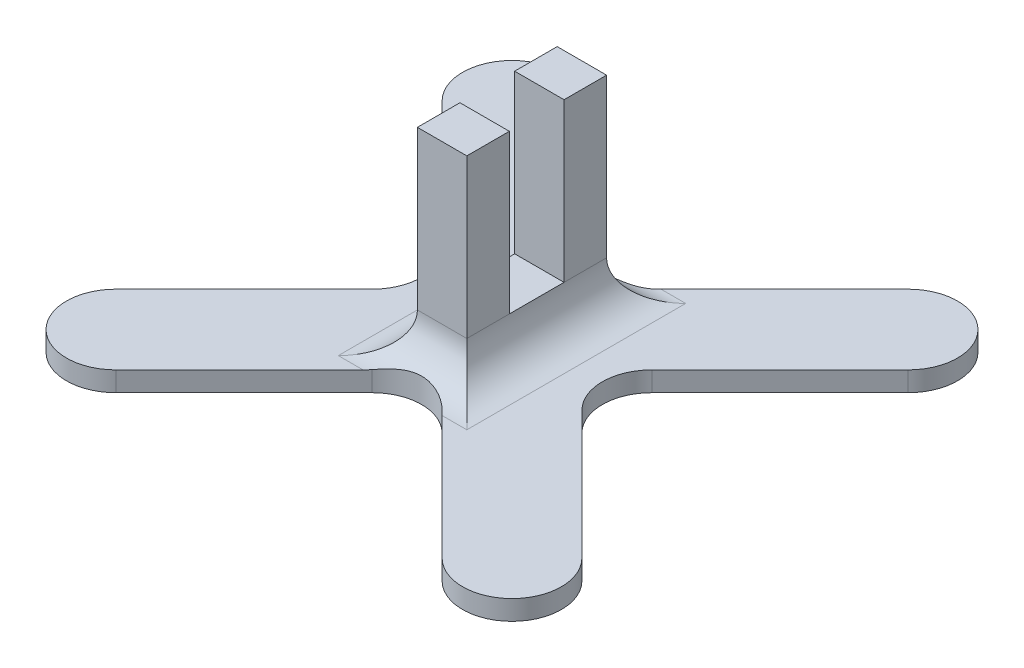
ISO-10303-21;
HEADER;
FILE_DESCRIPTION(('STEP AP214'),'2;1');
FILE_NAME('part.step','',(''),(''),'','','');
FILE_SCHEMA(('AUTOMOTIVE_DESIGN { 1 0 10303 214 1 1 1 1 }'));
ENDSEC;
DATA;
#1=APPLICATION_CONTEXT('core data for automotive mechanical design processes');
#2=APPLICATION_PROTOCOL_DEFINITION('international standard','automotive_design',2000,#1);
#3=PRODUCT_CONTEXT('',#1,'mechanical');
#4=PRODUCT('Part','Part','',(#3));
#5=PRODUCT_RELATED_PRODUCT_CATEGORY('part','',(#4));
#6=PRODUCT_DEFINITION_FORMATION('','',#4);
#7=PRODUCT_DEFINITION_CONTEXT('part definition',#1,'design');
#8=PRODUCT_DEFINITION('design','',#6,#7);
#9=PRODUCT_DEFINITION_SHAPE('','',#8);
#10=(LENGTH_UNIT() NAMED_UNIT(*) SI_UNIT(.MILLI.,.METRE.));
#11=(NAMED_UNIT(*) PLANE_ANGLE_UNIT() SI_UNIT($,.RADIAN.));
#12=(NAMED_UNIT(*) SI_UNIT($,.STERADIAN.) SOLID_ANGLE_UNIT());
#13=UNCERTAINTY_MEASURE_WITH_UNIT(LENGTH_MEASURE(1.E-05),#10,'distance_accuracy_value','');
#14=(GEOMETRIC_REPRESENTATION_CONTEXT(3) GLOBAL_UNCERTAINTY_ASSIGNED_CONTEXT((#13)) GLOBAL_UNIT_ASSIGNED_CONTEXT((#10,
#11,#12)) REPRESENTATION_CONTEXT('',''));
#15=CARTESIAN_POINT('',(0.,0.,0.));
#16=DIRECTION('',(0.,0.,1.));
#17=DIRECTION('',(1.,0.,0.));
#18=AXIS2_PLACEMENT_3D('',#15,#16,#17);
#19=CARTESIAN_POINT('',(3.75,0.,0.));
#20=DIRECTION('',(1.,0.,0.));
#21=DIRECTION('',(0.,0.,-1.));
#22=AXIS2_PLACEMENT_3D('',#19,#20,#21);
#23=PLANE('',#22);
#24=DIRECTION('',(0.,-1.,0.));
#25=VECTOR('',#24,1.);
#26=CARTESIAN_POINT('',(3.75,33.,10.6066017177982));
#27=LINE('',#26,#25);
#28=CARTESIAN_POINT('',(3.75,33.,10.6066017177982));
#29=VERTEX_POINT('',#28);
#30=CARTESIAN_POINT('',(3.75,9.00000000000001,10.6066017177982));
#31=VERTEX_POINT('',#30);
#32=EDGE_CURVE('E246',#29,#31,#27,.T.);
#33=ORIENTED_EDGE('',*,*,#32,.T.);
#34=DIRECTION('',(0.,0.,-1.));
#35=VECTOR('',#34,1.);
#36=CARTESIAN_POINT('',(3.75,9.,-10.6066017177982));
#37=LINE('',#36,#35);
#38=CARTESIAN_POINT('',(3.75,9.,4.15));
#39=VERTEX_POINT('',#38);
#40=EDGE_CURVE('E231',#31,#39,#37,.T.);
#41=ORIENTED_EDGE('',*,*,#40,.T.);
#42=DIRECTION('',(0.,1.,0.));
#43=VECTOR('',#42,1.);
#44=CARTESIAN_POINT('',(3.75,9.,4.15));
#45=LINE('',#44,#43);
#46=CARTESIAN_POINT('',(3.75,33.,4.15));
#47=VERTEX_POINT('',#46);
#48=EDGE_CURVE('E225',#39,#47,#45,.T.);
#49=ORIENTED_EDGE('',*,*,#48,.T.);
#50=DIRECTION('',(0.,0.,-1.));
#51=VECTOR('',#50,1.);
#52=CARTESIAN_POINT('',(3.75,33.,10.6066017177982));
#53=LINE('',#52,#51);
#54=EDGE_CURVE('E229',#29,#47,#53,.T.);
#55=ORIENTED_EDGE('',*,*,#54,.F.);
#56=EDGE_LOOP('',(#33,#41,#49,#55));
#57=FACE_BOUND('',#56,.T.);
#58=ADVANCED_FACE('F35',(#57),#23,.T.);
#59=CARTESIAN_POINT('',(-3.75,0.,0.));
#60=DIRECTION('',(1.,0.,0.));
#61=DIRECTION('',(0.,0.,-1.));
#62=AXIS2_PLACEMENT_3D('',#59,#60,#61);
#63=PLANE('',#62);
#64=DIRECTION('',(0.,-1.,0.));
#65=VECTOR('',#64,1.);
#66=CARTESIAN_POINT('',(-3.75,33.,-10.6066017177982));
#67=LINE('',#66,#65);
#68=CARTESIAN_POINT('',(-3.75,33.,-10.6066017177982));
#69=VERTEX_POINT('',#68);
#70=CARTESIAN_POINT('',(-3.75,9.00000000000001,-10.6066017177982));
#71=VERTEX_POINT('',#70);
#72=EDGE_CURVE('E254',#69,#71,#67,.T.);
#73=ORIENTED_EDGE('',*,*,#72,.T.);
#74=DIRECTION('',(0.,0.,-1.));
#75=VECTOR('',#74,1.);
#76=CARTESIAN_POINT('',(-3.75,9.,0.));
#77=LINE('',#76,#75);
#78=CARTESIAN_POINT('',(-3.75,9.,-4.15));
#79=VERTEX_POINT('',#78);
#80=EDGE_CURVE('E424',#71,#79,#77,.F.);
#81=ORIENTED_EDGE('',*,*,#80,.T.);
#82=DIRECTION('',(0.,1.,0.));
#83=VECTOR('',#82,1.);
#84=CARTESIAN_POINT('',(-3.75,9.,-4.15));
#85=LINE('',#84,#83);
#86=CARTESIAN_POINT('',(-3.75,33.,-4.15));
#87=VERTEX_POINT('',#86);
#88=EDGE_CURVE('E275',#79,#87,#85,.T.);
#89=ORIENTED_EDGE('',*,*,#88,.T.);
#90=DIRECTION('',(0.,0.,-1.));
#91=VECTOR('',#90,1.);
#92=CARTESIAN_POINT('',(-3.75,33.,-4.15));
#93=LINE('',#92,#91);
#94=EDGE_CURVE('E278',#87,#69,#93,.T.);
#95=ORIENTED_EDGE('',*,*,#94,.T.);
#96=EDGE_LOOP('',(#73,#81,#89,#95));
#97=FACE_BOUND('',#96,.T.);
#98=ADVANCED_FACE('F457',(#97),#63,.F.);
#99=CARTESIAN_POINT('',(-30.0520382004283,3.,-30.0520382004283));
#100=DIRECTION('',(0.,1.,0.));
#101=DIRECTION('',(0.,0.,1.));
#102=AXIS2_PLACEMENT_3D('',#99,#100,#101);
#103=PLANE('',#102);
#104=DIRECTION('',(0.707106781186547,0.,-0.707106781186548));
#105=VECTOR('',#104,1.);
#106=CARTESIAN_POINT('',(-24.7487373415291,3.,35.3553390593274));
#107=LINE('',#106,#105);
#108=CARTESIAN_POINT('',(-24.7487373415291,3.,35.3553390593274));
#109=VERTEX_POINT('',#108);
#110=CARTESIAN_POINT('',(-5.99999999999999,3.,16.6066017177982));
#111=VERTEX_POINT('',#110);
#112=EDGE_CURVE('E308',#109,#111,#107,.T.);
#113=ORIENTED_EDGE('',*,*,#112,.T.);
#114=DIRECTION('',(-1.,0.,0.));
#115=VECTOR('',#114,1.);
#116=CARTESIAN_POINT('',(-30.0520382004283,3.,16.6066017177982));
#117=LINE('',#116,#115);
#118=CARTESIAN_POINT('',(-9.75,3.,16.6066017177982));
#119=VERTEX_POINT('',#118);
#120=EDGE_CURVE('E414',#111,#119,#117,.T.);
#121=ORIENTED_EDGE('',*,*,#120,.T.);
#122=DIRECTION('',(0.,0.,-1.));
#123=VECTOR('',#122,1.);
#124=CARTESIAN_POINT('',(-9.75,3.,-30.0520382004283));
#125=LINE('',#124,#123);
#126=CARTESIAN_POINT('',(-9.75,3.,-16.6066017177982));
#127=VERTEX_POINT('',#126);
#128=EDGE_CURVE('E410',#119,#127,#125,.T.);
#129=ORIENTED_EDGE('',*,*,#128,.T.);
#130=DIRECTION('',(-1.,0.,0.));
#131=VECTOR('',#130,1.);
#132=CARTESIAN_POINT('',(0.,3.,-16.6066017177982));
#133=LINE('',#132,#131);
#134=CARTESIAN_POINT('',(-6.,3.,-16.6066017177982));
#135=VERTEX_POINT('',#134);
#136=EDGE_CURVE('E412',#127,#135,#133,.F.);
#137=ORIENTED_EDGE('',*,*,#136,.T.);
#138=DIRECTION('',(-0.707106781186548,0.,-0.707106781186547));
#139=VECTOR('',#138,1.);
#140=CARTESIAN_POINT('',(0.,3.,-10.6066017177982));
#141=LINE('',#140,#139);
#142=CARTESIAN_POINT('',(-24.7487373415292,3.,-35.3553390593274));
#143=VERTEX_POINT('',#142);
#144=EDGE_CURVE('E296',#135,#143,#141,.T.);
#145=ORIENTED_EDGE('',*,*,#144,.T.);
#146=CARTESIAN_POINT('',(-30.0520382004283,3.,-30.0520382004283));
#147=DIRECTION('',(0.,1.,0.));
#148=DIRECTION('',(0.,0.,1.));
#149=AXIS2_PLACEMENT_3D('',#146,#147,#148);
#150=CIRCLE('',#149,7.5);
#151=CARTESIAN_POINT('',(-35.3553390593274,3.,-24.7487373415292));
#152=VERTEX_POINT('',#151);
#153=EDGE_CURVE('E299',#143,#152,#150,.T.);
#154=ORIENTED_EDGE('',*,*,#153,.T.);
#155=DIRECTION('',(0.707106781186548,0.,0.707106781186547));
#156=VECTOR('',#155,1.);
#157=CARTESIAN_POINT('',(-35.3553390593274,3.,-24.7487373415292));
#158=LINE('',#157,#156);
#159=CARTESIAN_POINT('',(-15.9099025766973,3.,-5.3033008588991));
#160=VERTEX_POINT('',#159);
#161=EDGE_CURVE('E301',#152,#160,#158,.T.);
#162=ORIENTED_EDGE('',*,*,#161,.T.);
#163=CARTESIAN_POINT('',(-21.2132034355964,3.,0.));
#164=DIRECTION('',(0.,1.,0.));
#165=DIRECTION('',(0.,0.,1.));
#166=AXIS2_PLACEMENT_3D('',#163,#164,#165);
#167=CIRCLE('',#166,7.5);
#168=CARTESIAN_POINT('',(-15.9099025766973,3.,5.3033008588991));
#169=VERTEX_POINT('',#168);
#170=EDGE_CURVE('E400',#160,#169,#167,.F.);
#171=ORIENTED_EDGE('',*,*,#170,.T.);
#172=DIRECTION('',(-0.707106781186547,0.,0.707106781186548));
#173=VECTOR('',#172,1.);
#174=CARTESIAN_POINT('',(-10.6066017177982,3.,0.));
#175=LINE('',#174,#173);
#176=CARTESIAN_POINT('',(-35.3553390593273,3.,24.7487373415292));
#177=VERTEX_POINT('',#176);
#178=EDGE_CURVE('E304',#169,#177,#175,.T.);
#179=ORIENTED_EDGE('',*,*,#178,.T.);
#180=CARTESIAN_POINT('',(-30.0520382004282,3.,30.0520382004283));
#181=DIRECTION('',(0.,1.,0.));
#182=DIRECTION('',(0.,0.,1.));
#183=AXIS2_PLACEMENT_3D('',#180,#181,#182);
#184=CIRCLE('',#183,7.5);
#185=EDGE_CURVE('E306',#177,#109,#184,.T.);
#186=ORIENTED_EDGE('',*,*,#185,.T.);
#187=EDGE_LOOP('',(#113,#121,#129,#137,#145,#154,#162,#171,#179,#186));
#188=FACE_BOUND('',#187,.T.);
#189=ADVANCED_FACE('F463',(#188),#103,.T.);
#190=DIRECTION('',(0.,0.,-1.));
#191=VECTOR('',#190,1.);
#192=CARTESIAN_POINT('',(9.75,3.,10.6066017177982));
#193=LINE('',#192,#191);
#194=CARTESIAN_POINT('',(9.75,3.,-16.6066017177982));
#195=VERTEX_POINT('',#194);
#196=CARTESIAN_POINT('',(9.75,3.,16.6066017177982));
#197=VERTEX_POINT('',#196);
#198=EDGE_CURVE('E404',#195,#197,#193,.F.);
#199=ORIENTED_EDGE('',*,*,#198,.T.);
#200=DIRECTION('',(-1.,0.,0.));
#201=VECTOR('',#200,1.);
#202=CARTESIAN_POINT('',(-30.0520382004283,3.,16.6066017177982));
#203=LINE('',#202,#201);
#204=CARTESIAN_POINT('',(6.00000000000005,3.,16.6066017177982));
#205=VERTEX_POINT('',#204);
#206=EDGE_CURVE('E408',#197,#205,#203,.T.);
#207=ORIENTED_EDGE('',*,*,#206,.T.);
#208=DIRECTION('',(0.707106781186548,0.,0.707106781186547));
#209=VECTOR('',#208,1.);
#210=CARTESIAN_POINT('',(0.,3.,10.6066017177982));
#211=LINE('',#210,#209);
#212=CARTESIAN_POINT('',(24.7487373415292,3.,35.3553390593274));
#213=VERTEX_POINT('',#212);
#214=EDGE_CURVE('E311',#205,#213,#211,.T.);
#215=ORIENTED_EDGE('',*,*,#214,.T.);
#216=CARTESIAN_POINT('',(30.0520382004283,3.,30.0520382004282));
#217=DIRECTION('',(0.,1.,0.));
#218=DIRECTION('',(0.,0.,1.));
#219=AXIS2_PLACEMENT_3D('',#216,#217,#218);
#220=CIRCLE('',#219,7.5);
#221=CARTESIAN_POINT('',(35.3553390593274,3.,24.7487373415291));
#222=VERTEX_POINT('',#221);
#223=EDGE_CURVE('E313',#213,#222,#220,.T.);
#224=ORIENTED_EDGE('',*,*,#223,.T.);
#225=DIRECTION('',(-0.707106781186548,0.,-0.707106781186547));
#226=VECTOR('',#225,1.);
#227=CARTESIAN_POINT('',(35.3553390593274,3.,24.7487373415291));
#228=LINE('',#227,#226);
#229=CARTESIAN_POINT('',(15.9099025766973,3.,5.30330085889908));
#230=VERTEX_POINT('',#229);
#231=EDGE_CURVE('E315',#222,#230,#228,.T.);
#232=ORIENTED_EDGE('',*,*,#231,.T.);
#233=CARTESIAN_POINT('',(21.2132034355964,3.,0.));
#234=DIRECTION('',(0.,1.,0.));
#235=DIRECTION('',(0.,0.,1.));
#236=AXIS2_PLACEMENT_3D('',#233,#234,#235);
#237=CIRCLE('',#236,7.5);
#238=CARTESIAN_POINT('',(15.9099025766973,3.,-5.30330085889913));
#239=VERTEX_POINT('',#238);
#240=EDGE_CURVE('E394',#230,#239,#237,.F.);
#241=ORIENTED_EDGE('',*,*,#240,.T.);
#242=DIRECTION('',(0.707106781186547,0.,-0.707106781186548));
#243=VECTOR('',#242,1.);
#244=CARTESIAN_POINT('',(10.6066017177982,3.,0.));
#245=LINE('',#244,#243);
#246=CARTESIAN_POINT('',(35.3553390593274,3.,-24.7487373415292));
#247=VERTEX_POINT('',#246);
#248=EDGE_CURVE('E318',#239,#247,#245,.T.);
#249=ORIENTED_EDGE('',*,*,#248,.T.);
#250=CARTESIAN_POINT('',(30.0520382004283,3.,-30.0520382004283));
#251=DIRECTION('',(0.,1.,0.));
#252=DIRECTION('',(0.,0.,1.));
#253=AXIS2_PLACEMENT_3D('',#250,#251,#252);
#254=CIRCLE('',#253,7.5);
#255=CARTESIAN_POINT('',(24.7487373415292,3.,-35.3553390593274));
#256=VERTEX_POINT('',#255);
#257=EDGE_CURVE('E320',#247,#256,#254,.T.);
#258=ORIENTED_EDGE('',*,*,#257,.T.);
#259=DIRECTION('',(-0.707106781186547,0.,0.707106781186548));
#260=VECTOR('',#259,1.);
#261=CARTESIAN_POINT('',(24.7487373415292,3.,-35.3553390593274));
#262=LINE('',#261,#260);
#263=CARTESIAN_POINT('',(5.99999999999999,3.,-16.6066017177982));
#264=VERTEX_POINT('',#263);
#265=EDGE_CURVE('E293',#256,#264,#262,.T.);
#266=ORIENTED_EDGE('',*,*,#265,.T.);
#267=DIRECTION('',(-1.,0.,0.));
#268=VECTOR('',#267,1.);
#269=CARTESIAN_POINT('',(3.75,3.,-16.6066017177982));
#270=LINE('',#269,#268);
#271=EDGE_CURVE('E406',#264,#195,#270,.F.);
#272=ORIENTED_EDGE('',*,*,#271,.T.);
#273=EDGE_LOOP('',(#199,#207,#215,#224,#232,#241,#249,#258,#266,#272));
#274=FACE_BOUND('',#273,.T.);
#275=ADVANCED_FACE('F555',(#274),#103,.T.);
#276=CARTESIAN_POINT('',(24.7487373415292,3.,-35.3553390593274));
#277=DIRECTION('',(0.707106781186548,0.,0.707106781186547));
#278=DIRECTION('',(0.707106781186547,0.,-0.707106781186548));
#279=AXIS2_PLACEMENT_3D('',#276,#277,#278);
#280=PLANE('',#279);
#281=DIRECTION('',(-0.707106781186547,0.,0.707106781186548));
#282=VECTOR('',#281,1.);
#283=CARTESIAN_POINT('',(24.7487373415292,0.,-35.3553390593274));
#284=LINE('',#283,#282);
#285=CARTESIAN_POINT('',(24.7487373415292,0.,-35.3553390593274));
#286=VERTEX_POINT('',#285);
#287=CARTESIAN_POINT('',(5.3033008588991,0.,-15.9099025766973));
#288=VERTEX_POINT('',#287);
#289=EDGE_CURVE('E284',#286,#288,#284,.T.);
#290=ORIENTED_EDGE('',*,*,#289,.T.);
#291=DIRECTION('',(0.,-1.,0.));
#292=VECTOR('',#291,1.);
#293=CARTESIAN_POINT('',(5.3033008588991,3.,-15.9099025766973));
#294=LINE('',#293,#292);
#295=CARTESIAN_POINT('',(5.3033008588991,3.04058641250758,-15.9099025766973));
#296=VERTEX_POINT('',#295);
#297=EDGE_CURVE('E390',#288,#296,#294,.F.);
#298=ORIENTED_EDGE('',*,*,#297,.T.);
#299=CARTESIAN_POINT('',(5.99999999999999,9.,-16.6066017177982));
#300=DIRECTION('',(0.707106781186548,0.,0.707106781186547));
#301=DIRECTION('',(0.707106781186547,0.,-0.707106781186548));
#302=AXIS2_PLACEMENT_3D('',#299,#300,#301);
#303=ELLIPSE('',#302,8.48528137423857,6.);
#304=EDGE_CURVE('E11',#296,#264,#303,.T.);
#305=ORIENTED_EDGE('',*,*,#304,.T.);
#306=ORIENTED_EDGE('',*,*,#265,.F.);
#307=DIRECTION('',(0.,-1.,0.));
#308=VECTOR('',#307,1.);
#309=CARTESIAN_POINT('',(24.7487373415292,3.,-35.3553390593274));
#310=LINE('',#309,#308);
#311=EDGE_CURVE('E322',#256,#286,#310,.T.);
#312=ORIENTED_EDGE('',*,*,#311,.T.);
#313=EDGE_LOOP('',(#290,#298,#305,#306,#312));
#314=FACE_BOUND('',#313,.T.);
#315=ADVANCED_FACE('F558',(#314),#280,.F.);
#316=CARTESIAN_POINT('',(0.,3.,-10.6066017177982));
#317=DIRECTION('',(-0.707106781186547,0.,0.707106781186548));
#318=DIRECTION('',(0.707106781186548,0.,0.707106781186547));
#319=AXIS2_PLACEMENT_3D('',#316,#317,#318);
#320=PLANE('',#319);
#321=ORIENTED_EDGE('',*,*,#144,.F.);
#322=CARTESIAN_POINT('',(-6.,9.,-16.6066017177982));
#323=DIRECTION('',(-0.707106781186547,0.,0.707106781186548));
#324=DIRECTION('',(0.707106781186548,0.,0.707106781186547));
#325=AXIS2_PLACEMENT_3D('',#322,#323,#324);
#326=ELLIPSE('',#325,8.48528137423857,6.);
#327=CARTESIAN_POINT('',(-5.30330085889911,3.04058641250758,-15.9099025766973));
#328=VERTEX_POINT('',#327);
#329=EDGE_CURVE('E506',#135,#328,#326,.T.);
#330=ORIENTED_EDGE('',*,*,#329,.T.);
#331=DIRECTION('',(0.,-1.,0.));
#332=VECTOR('',#331,1.);
#333=CARTESIAN_POINT('',(-5.30330085889911,0.,-15.9099025766973));
#334=LINE('',#333,#332);
#335=CARTESIAN_POINT('',(-5.30330085889911,0.,-15.9099025766973));
#336=VERTEX_POINT('',#335);
#337=EDGE_CURVE('E387',#328,#336,#334,.T.);
#338=ORIENTED_EDGE('',*,*,#337,.T.);
#339=DIRECTION('',(-0.707106781186548,0.,-0.707106781186547));
#340=VECTOR('',#339,1.);
#341=CARTESIAN_POINT('',(0.,0.,-10.6066017177982));
#342=LINE('',#341,#340);
#343=CARTESIAN_POINT('',(-24.7487373415292,0.,-35.3553390593274));
#344=VERTEX_POINT('',#343);
#345=EDGE_CURVE('E325',#336,#344,#342,.T.);
#346=ORIENTED_EDGE('',*,*,#345,.T.);
#347=DIRECTION('',(0.,-1.,0.));
#348=VECTOR('',#347,1.);
#349=CARTESIAN_POINT('',(-24.7487373415292,3.,-35.3553390593274));
#350=LINE('',#349,#348);
#351=EDGE_CURVE('E369',#143,#344,#350,.T.);
#352=ORIENTED_EDGE('',*,*,#351,.F.);
#353=EDGE_LOOP('',(#321,#330,#338,#346,#352));
#354=FACE_BOUND('',#353,.T.);
#355=ADVANCED_FACE('F562',(#354),#320,.F.);
#356=CARTESIAN_POINT('',(-30.0520382004283,3.,-30.0520382004283));
#357=DIRECTION('',(0.,-1.,0.));
#358=DIRECTION('',(0.,0.,-1.));
#359=AXIS2_PLACEMENT_3D('',#356,#357,#358);
#360=CYLINDRICAL_SURFACE('',#359,7.5);
#361=CARTESIAN_POINT('',(-30.0520382004283,0.,-30.0520382004283));
#362=DIRECTION('',(0.,1.,0.));
#363=DIRECTION('',(0.,0.,1.));
#364=AXIS2_PLACEMENT_3D('',#361,#362,#363);
#365=CIRCLE('',#364,7.5);
#366=CARTESIAN_POINT('',(-35.3553390593274,0.,-24.7487373415292));
#367=VERTEX_POINT('',#366);
#368=EDGE_CURVE('E327',#344,#367,#365,.T.);
#369=ORIENTED_EDGE('',*,*,#368,.T.);
#370=DIRECTION('',(0.,-1.,0.));
#371=VECTOR('',#370,1.);
#372=CARTESIAN_POINT('',(-35.3553390593274,3.,-24.7487373415292));
#373=LINE('',#372,#371);
#374=EDGE_CURVE('E366',#152,#367,#373,.T.);
#375=ORIENTED_EDGE('',*,*,#374,.F.);
#376=ORIENTED_EDGE('',*,*,#153,.F.);
#377=ORIENTED_EDGE('',*,*,#351,.T.);
#378=EDGE_LOOP('',(#369,#375,#376,#377));
#379=FACE_BOUND('',#378,.T.);
#380=ADVANCED_FACE('F569',(#379),#360,.T.);
#381=CARTESIAN_POINT('',(-35.3553390593274,3.,-24.7487373415292));
#382=DIRECTION('',(0.707106781186547,0.,-0.707106781186548));
#383=DIRECTION('',(-0.707106781186548,0.,-0.707106781186547));
#384=AXIS2_PLACEMENT_3D('',#381,#382,#383);
#385=PLANE('',#384);
#386=DIRECTION('',(0.707106781186548,0.,0.707106781186547));
#387=VECTOR('',#386,1.);
#388=CARTESIAN_POINT('',(-35.3553390593274,0.,-24.7487373415292));
#389=LINE('',#388,#387);
#390=CARTESIAN_POINT('',(-15.9099025766973,0.,-5.3033008588991));
#391=VERTEX_POINT('',#390);
#392=EDGE_CURVE('E329',#367,#391,#389,.T.);
#393=ORIENTED_EDGE('',*,*,#392,.T.);
#394=DIRECTION('',(0.,-1.,0.));
#395=VECTOR('',#394,1.);
#396=CARTESIAN_POINT('',(-15.9099025766973,3.,-5.3033008588991));
#397=LINE('',#396,#395);
#398=EDGE_CURVE('E385',#391,#160,#397,.F.);
#399=ORIENTED_EDGE('',*,*,#398,.T.);
#400=ORIENTED_EDGE('',*,*,#161,.F.);
#401=ORIENTED_EDGE('',*,*,#374,.T.);
#402=EDGE_LOOP('',(#393,#399,#400,#401));
#403=FACE_BOUND('',#402,.T.);
#404=ADVANCED_FACE('F572',(#403),#385,.F.);
#405=CARTESIAN_POINT('',(-10.6066017177982,3.,0.));
#406=DIRECTION('',(0.707106781186548,0.,0.707106781186547));
#407=DIRECTION('',(0.707106781186547,0.,-0.707106781186548));
#408=AXIS2_PLACEMENT_3D('',#405,#406,#407);
#409=PLANE('',#408);
#410=ORIENTED_EDGE('',*,*,#178,.F.);
#411=DIRECTION('',(0.,-1.,0.));
#412=VECTOR('',#411,1.);
#413=CARTESIAN_POINT('',(-15.9099025766973,0.,5.3033008588991));
#414=LINE('',#413,#412);
#415=CARTESIAN_POINT('',(-15.9099025766973,0.,5.3033008588991));
#416=VERTEX_POINT('',#415);
#417=EDGE_CURVE('E382',#169,#416,#414,.T.);
#418=ORIENTED_EDGE('',*,*,#417,.T.);
#419=DIRECTION('',(-0.707106781186547,0.,0.707106781186548));
#420=VECTOR('',#419,1.);
#421=CARTESIAN_POINT('',(-10.6066017177982,0.,0.));
#422=LINE('',#421,#420);
#423=CARTESIAN_POINT('',(-35.3553390593273,0.,24.7487373415292));
#424=VERTEX_POINT('',#423);
#425=EDGE_CURVE('E332',#416,#424,#422,.T.);
#426=ORIENTED_EDGE('',*,*,#425,.T.);
#427=DIRECTION('',(0.,-1.,0.));
#428=VECTOR('',#427,1.);
#429=CARTESIAN_POINT('',(-35.3553390593273,3.,24.7487373415292));
#430=LINE('',#429,#428);
#431=EDGE_CURVE('E363',#177,#424,#430,.T.);
#432=ORIENTED_EDGE('',*,*,#431,.F.);
#433=EDGE_LOOP('',(#410,#418,#426,#432));
#434=FACE_BOUND('',#433,.T.);
#435=ADVANCED_FACE('F524',(#434),#409,.F.);
#436=CARTESIAN_POINT('',(-30.0520382004282,3.,30.0520382004283));
#437=DIRECTION('',(0.,-1.,0.));
#438=DIRECTION('',(0.,0.,-1.));
#439=AXIS2_PLACEMENT_3D('',#436,#437,#438);
#440=CYLINDRICAL_SURFACE('',#439,7.5);
#441=CARTESIAN_POINT('',(-30.0520382004282,0.,30.0520382004283));
#442=DIRECTION('',(0.,1.,0.));
#443=DIRECTION('',(0.,0.,1.));
#444=AXIS2_PLACEMENT_3D('',#441,#442,#443);
#445=CIRCLE('',#444,7.5);
#446=CARTESIAN_POINT('',(-24.7487373415291,0.,35.3553390593274));
#447=VERTEX_POINT('',#446);
#448=EDGE_CURVE('E334',#424,#447,#445,.T.);
#449=ORIENTED_EDGE('',*,*,#448,.T.);
#450=DIRECTION('',(0.,-1.,0.));
#451=VECTOR('',#450,1.);
#452=CARTESIAN_POINT('',(-24.7487373415291,3.,35.3553390593274));
#453=LINE('',#452,#451);
#454=EDGE_CURVE('E360',#109,#447,#453,.T.);
#455=ORIENTED_EDGE('',*,*,#454,.F.);
#456=ORIENTED_EDGE('',*,*,#185,.F.);
#457=ORIENTED_EDGE('',*,*,#431,.T.);
#458=EDGE_LOOP('',(#449,#455,#456,#457));
#459=FACE_BOUND('',#458,.T.);
#460=ADVANCED_FACE('F530',(#459),#440,.T.);
#461=CARTESIAN_POINT('',(-24.7487373415291,3.,35.3553390593274));
#462=DIRECTION('',(-0.707106781186548,0.,-0.707106781186547));
#463=DIRECTION('',(-0.707106781186547,0.,0.707106781186548));
#464=AXIS2_PLACEMENT_3D('',#461,#462,#463);
#465=PLANE('',#464);
#466=DIRECTION('',(0.707106781186547,0.,-0.707106781186548));
#467=VECTOR('',#466,1.);
#468=CARTESIAN_POINT('',(-24.7487373415291,0.,35.3553390593274));
#469=LINE('',#468,#467);
#470=CARTESIAN_POINT('',(-5.30330085889908,0.,15.9099025766973));
#471=VERTEX_POINT('',#470);
#472=EDGE_CURVE('E336',#447,#471,#469,.T.);
#473=ORIENTED_EDGE('',*,*,#472,.T.);
#474=DIRECTION('',(0.,-1.,0.));
#475=VECTOR('',#474,1.);
#476=CARTESIAN_POINT('',(-5.30330085889908,3.,15.9099025766973));
#477=LINE('',#476,#475);
#478=CARTESIAN_POINT('',(-5.30330085889908,3.04058641250758,15.9099025766973));
#479=VERTEX_POINT('',#478);
#480=EDGE_CURVE('E380',#471,#479,#477,.F.);
#481=ORIENTED_EDGE('',*,*,#480,.T.);
#482=CARTESIAN_POINT('',(-6.,9.,16.6066017177982));
#483=DIRECTION('',(-0.707106781186548,0.,-0.707106781186547));
#484=DIRECTION('',(-0.707106781186547,0.,0.707106781186548));
#485=AXIS2_PLACEMENT_3D('',#482,#483,#484);
#486=ELLIPSE('',#485,8.48528137423857,6.);
#487=EDGE_CURVE('E436',#479,#111,#486,.T.);
#488=ORIENTED_EDGE('',*,*,#487,.T.);
#489=ORIENTED_EDGE('',*,*,#112,.F.);
#490=ORIENTED_EDGE('',*,*,#454,.T.);
#491=EDGE_LOOP('',(#473,#481,#488,#489,#490));
#492=FACE_BOUND('',#491,.T.);
#493=ADVANCED_FACE('F546',(#492),#465,.F.);
#494=CARTESIAN_POINT('',(0.,3.,10.6066017177982));
#495=DIRECTION('',(0.707106781186547,0.,-0.707106781186548));
#496=DIRECTION('',(-0.707106781186548,0.,-0.707106781186547));
#497=AXIS2_PLACEMENT_3D('',#494,#495,#496);
#498=PLANE('',#497);
#499=ORIENTED_EDGE('',*,*,#214,.F.);
#500=CARTESIAN_POINT('',(6.00000000000005,9.,16.6066017177982));
#501=DIRECTION('',(0.707106781186547,0.,-0.707106781186548));
#502=DIRECTION('',(-0.707106781186548,0.,-0.707106781186547));
#503=AXIS2_PLACEMENT_3D('',#500,#501,#502);
#504=ELLIPSE('',#503,8.48528137423857,6.);
#505=CARTESIAN_POINT('',(5.30330085889913,3.04058641250758,15.9099025766973));
#506=VERTEX_POINT('',#505);
#507=EDGE_CURVE('E45',#205,#506,#504,.T.);
#508=ORIENTED_EDGE('',*,*,#507,.T.);
#509=DIRECTION('',(0.,-1.,0.));
#510=VECTOR('',#509,1.);
#511=CARTESIAN_POINT('',(5.30330085889913,0.,15.9099025766973));
#512=LINE('',#511,#510);
#513=CARTESIAN_POINT('',(5.30330085889913,0.,15.9099025766973));
#514=VERTEX_POINT('',#513);
#515=EDGE_CURVE('E377',#506,#514,#512,.T.);
#516=ORIENTED_EDGE('',*,*,#515,.T.);
#517=DIRECTION('',(0.707106781186548,0.,0.707106781186547));
#518=VECTOR('',#517,1.);
#519=CARTESIAN_POINT('',(0.,0.,10.6066017177982));
#520=LINE('',#519,#518);
#521=CARTESIAN_POINT('',(24.7487373415292,0.,35.3553390593274));
#522=VERTEX_POINT('',#521);
#523=EDGE_CURVE('E339',#514,#522,#520,.T.);
#524=ORIENTED_EDGE('',*,*,#523,.T.);
#525=DIRECTION('',(0.,-1.,0.));
#526=VECTOR('',#525,1.);
#527=CARTESIAN_POINT('',(24.7487373415292,3.,35.3553390593274));
#528=LINE('',#527,#526);
#529=EDGE_CURVE('E357',#213,#522,#528,.T.);
#530=ORIENTED_EDGE('',*,*,#529,.F.);
#531=EDGE_LOOP('',(#499,#508,#516,#524,#530));
#532=FACE_BOUND('',#531,.T.);
#533=ADVANCED_FACE('F552',(#532),#498,.F.);
#534=CARTESIAN_POINT('',(30.0520382004283,3.,30.0520382004282));
#535=DIRECTION('',(0.,-1.,0.));
#536=DIRECTION('',(0.,0.,-1.));
#537=AXIS2_PLACEMENT_3D('',#534,#535,#536);
#538=CYLINDRICAL_SURFACE('',#537,7.5);
#539=CARTESIAN_POINT('',(30.0520382004283,0.,30.0520382004282));
#540=DIRECTION('',(0.,1.,0.));
#541=DIRECTION('',(0.,0.,1.));
#542=AXIS2_PLACEMENT_3D('',#539,#540,#541);
#543=CIRCLE('',#542,7.5);
#544=CARTESIAN_POINT('',(35.3553390593274,0.,24.7487373415291));
#545=VERTEX_POINT('',#544);
#546=EDGE_CURVE('E341',#522,#545,#543,.T.);
#547=ORIENTED_EDGE('',*,*,#546,.T.);
#548=DIRECTION('',(0.,-1.,0.));
#549=VECTOR('',#548,1.);
#550=CARTESIAN_POINT('',(35.3553390593274,3.,24.7487373415291));
#551=LINE('',#550,#549);
#552=EDGE_CURVE('E354',#222,#545,#551,.T.);
#553=ORIENTED_EDGE('',*,*,#552,.F.);
#554=ORIENTED_EDGE('',*,*,#223,.F.);
#555=ORIENTED_EDGE('',*,*,#529,.T.);
#556=EDGE_LOOP('',(#547,#553,#554,#555));
#557=FACE_BOUND('',#556,.T.);
#558=ADVANCED_FACE('F611',(#557),#538,.T.);
#559=CARTESIAN_POINT('',(35.3553390593274,3.,24.7487373415291));
#560=DIRECTION('',(-0.707106781186547,0.,0.707106781186548));
#561=DIRECTION('',(0.707106781186548,0.,0.707106781186547));
#562=AXIS2_PLACEMENT_3D('',#559,#560,#561);
#563=PLANE('',#562);
#564=DIRECTION('',(-0.707106781186548,0.,-0.707106781186547));
#565=VECTOR('',#564,1.);
#566=CARTESIAN_POINT('',(35.3553390593274,0.,24.7487373415291));
#567=LINE('',#566,#565);
#568=CARTESIAN_POINT('',(15.9099025766973,0.,5.30330085889908));
#569=VERTEX_POINT('',#568);
#570=EDGE_CURVE('E343',#545,#569,#567,.T.);
#571=ORIENTED_EDGE('',*,*,#570,.T.);
#572=DIRECTION('',(0.,-1.,0.));
#573=VECTOR('',#572,1.);
#574=CARTESIAN_POINT('',(15.9099025766973,3.,5.30330085889908));
#575=LINE('',#574,#573);
#576=EDGE_CURVE('E375',#569,#230,#575,.F.);
#577=ORIENTED_EDGE('',*,*,#576,.T.);
#578=ORIENTED_EDGE('',*,*,#231,.F.);
#579=ORIENTED_EDGE('',*,*,#552,.T.);
#580=EDGE_LOOP('',(#571,#577,#578,#579));
#581=FACE_BOUND('',#580,.T.);
#582=ADVANCED_FACE('F607',(#581),#563,.F.);
#583=CARTESIAN_POINT('',(10.6066017177982,3.,0.));
#584=DIRECTION('',(-0.707106781186548,0.,-0.707106781186547));
#585=DIRECTION('',(-0.707106781186547,0.,0.707106781186548));
#586=AXIS2_PLACEMENT_3D('',#583,#584,#585);
#587=PLANE('',#586);
#588=ORIENTED_EDGE('',*,*,#248,.F.);
#589=DIRECTION('',(0.,-1.,0.));
#590=VECTOR('',#589,1.);
#591=CARTESIAN_POINT('',(15.9099025766973,0.,-5.30330085889913));
#592=LINE('',#591,#590);
#593=CARTESIAN_POINT('',(15.9099025766973,0.,-5.30330085889913));
#594=VERTEX_POINT('',#593);
#595=EDGE_CURVE('E372',#239,#594,#592,.T.);
#596=ORIENTED_EDGE('',*,*,#595,.T.);
#597=DIRECTION('',(0.707106781186547,0.,-0.707106781186548));
#598=VECTOR('',#597,1.);
#599=CARTESIAN_POINT('',(10.6066017177982,0.,0.));
#600=LINE('',#599,#598);
#601=CARTESIAN_POINT('',(35.3553390593274,0.,-24.7487373415292));
#602=VERTEX_POINT('',#601);
#603=EDGE_CURVE('E346',#594,#602,#600,.T.);
#604=ORIENTED_EDGE('',*,*,#603,.T.);
#605=DIRECTION('',(0.,-1.,0.));
#606=VECTOR('',#605,1.);
#607=CARTESIAN_POINT('',(35.3553390593274,3.,-24.7487373415292));
#608=LINE('',#607,#606);
#609=EDGE_CURVE('E351',#247,#602,#608,.T.);
#610=ORIENTED_EDGE('',*,*,#609,.F.);
#611=EDGE_LOOP('',(#588,#596,#604,#610));
#612=FACE_BOUND('',#611,.T.);
#613=ADVANCED_FACE('F597',(#612),#587,.F.);
#614=CARTESIAN_POINT('',(30.0520382004283,3.,-30.0520382004283));
#615=DIRECTION('',(0.,-1.,0.));
#616=DIRECTION('',(0.,0.,-1.));
#617=AXIS2_PLACEMENT_3D('',#614,#615,#616);
#618=CYLINDRICAL_SURFACE('',#617,7.5);
#619=CARTESIAN_POINT('',(30.0520382004283,0.,-30.0520382004283));
#620=DIRECTION('',(0.,1.,0.));
#621=DIRECTION('',(0.,0.,1.));
#622=AXIS2_PLACEMENT_3D('',#619,#620,#621);
#623=CIRCLE('',#622,7.5);
#624=EDGE_CURVE('E297',#602,#286,#623,.T.);
#625=ORIENTED_EDGE('',*,*,#624,.T.);
#626=ORIENTED_EDGE('',*,*,#311,.F.);
#627=ORIENTED_EDGE('',*,*,#257,.F.);
#628=ORIENTED_EDGE('',*,*,#609,.T.);
#629=EDGE_LOOP('',(#625,#626,#627,#628));
#630=FACE_BOUND('',#629,.T.);
#631=ADVANCED_FACE('F603',(#630),#618,.T.);
#632=CARTESIAN_POINT('',(-30.0520382004283,0.,-30.0520382004283));
#633=DIRECTION('',(0.,1.,0.));
#634=DIRECTION('',(0.,0.,1.));
#635=AXIS2_PLACEMENT_3D('',#632,#633,#634);
#636=PLANE('',#635);
#637=ORIENTED_EDGE('',*,*,#289,.F.);
#638=ORIENTED_EDGE('',*,*,#624,.F.);
#639=ORIENTED_EDGE('',*,*,#603,.F.);
#640=CARTESIAN_POINT('',(21.2132034355964,0.,0.));
#641=DIRECTION('',(0.,1.,0.));
#642=DIRECTION('',(0.,0.,1.));
#643=AXIS2_PLACEMENT_3D('',#640,#641,#642);
#644=CIRCLE('',#643,7.5);
#645=EDGE_CURVE('E392',#594,#569,#644,.T.);
#646=ORIENTED_EDGE('',*,*,#645,.T.);
#647=ORIENTED_EDGE('',*,*,#570,.F.);
#648=ORIENTED_EDGE('',*,*,#546,.F.);
#649=ORIENTED_EDGE('',*,*,#523,.F.);
#650=CARTESIAN_POINT('',(0.,0.,21.2132034355964));
#651=DIRECTION('',(0.,1.,0.));
#652=DIRECTION('',(0.,0.,1.));
#653=AXIS2_PLACEMENT_3D('',#650,#651,#652);
#654=CIRCLE('',#653,7.5);
#655=EDGE_CURVE('E396',#514,#471,#654,.T.);
#656=ORIENTED_EDGE('',*,*,#655,.T.);
#657=ORIENTED_EDGE('',*,*,#472,.F.);
#658=ORIENTED_EDGE('',*,*,#448,.F.);
#659=ORIENTED_EDGE('',*,*,#425,.F.);
#660=CARTESIAN_POINT('',(-21.2132034355964,0.,0.));
#661=DIRECTION('',(0.,1.,0.));
#662=DIRECTION('',(0.,0.,1.));
#663=AXIS2_PLACEMENT_3D('',#660,#661,#662);
#664=CIRCLE('',#663,7.5);
#665=EDGE_CURVE('E398',#416,#391,#664,.T.);
#666=ORIENTED_EDGE('',*,*,#665,.T.);
#667=ORIENTED_EDGE('',*,*,#392,.F.);
#668=ORIENTED_EDGE('',*,*,#368,.F.);
#669=ORIENTED_EDGE('',*,*,#345,.F.);
#670=CARTESIAN_POINT('',(0.,0.,-21.2132034355964));
#671=DIRECTION('',(0.,1.,0.));
#672=DIRECTION('',(0.,0.,1.));
#673=AXIS2_PLACEMENT_3D('',#670,#671,#672);
#674=CIRCLE('',#673,7.5);
#675=EDGE_CURVE('E402',#336,#288,#674,.T.);
#676=ORIENTED_EDGE('',*,*,#675,.T.);
#677=EDGE_LOOP('',(#637,#638,#639,#646,#647,#648,#649,#656,#657,#658,#659,#666,#667,#668,#669,#676));
#678=FACE_BOUND('',#677,.T.);
#679=ADVANCED_FACE('F565',(#678),#636,.F.);
#680=CARTESIAN_POINT('',(3.75,33.,10.6066017177982));
#681=DIRECTION('',(0.,1.,0.));
#682=DIRECTION('',(0.,0.,1.));
#683=AXIS2_PLACEMENT_3D('',#680,#681,#682);
#684=PLANE('',#683);
#685=DIRECTION('',(0.,0.,-1.));
#686=VECTOR('',#685,1.);
#687=CARTESIAN_POINT('',(-3.75,33.,10.6066017177982));
#688=LINE('',#687,#686);
#689=CARTESIAN_POINT('',(-3.75,33.,10.6066017177982));
#690=VERTEX_POINT('',#689);
#691=CARTESIAN_POINT('',(-3.75,33.,4.15));
#692=VERTEX_POINT('',#691);
#693=EDGE_CURVE('E269',#690,#692,#688,.T.);
#694=ORIENTED_EDGE('',*,*,#693,.F.);
#695=DIRECTION('',(-1.,0.,0.));
#696=VECTOR('',#695,1.);
#697=CARTESIAN_POINT('',(3.75,33.,10.6066017177982));
#698=LINE('',#697,#696);
#699=EDGE_CURVE('E249',#29,#690,#698,.T.);
#700=ORIENTED_EDGE('',*,*,#699,.F.);
#701=ORIENTED_EDGE('',*,*,#54,.T.);
#702=DIRECTION('',(-1.,0.,0.));
#703=VECTOR('',#702,1.);
#704=CARTESIAN_POINT('',(3.75,33.,4.15));
#705=LINE('',#704,#703);
#706=EDGE_CURVE('E238',#47,#692,#705,.T.);
#707=ORIENTED_EDGE('',*,*,#706,.T.);
#708=EDGE_LOOP('',(#694,#700,#701,#707));
#709=FACE_BOUND('',#708,.T.);
#710=ADVANCED_FACE('F248',(#709),#684,.T.);
#711=CARTESIAN_POINT('',(3.75,33.,10.6066017177982));
#712=DIRECTION('',(0.,0.,-1.));
#713=DIRECTION('',(-1.,0.,0.));
#714=AXIS2_PLACEMENT_3D('',#711,#712,#713);
#715=PLANE('',#714);
#716=DIRECTION('',(0.,-1.,0.));
#717=VECTOR('',#716,1.);
#718=CARTESIAN_POINT('',(-3.75,33.,10.6066017177982));
#719=LINE('',#718,#717);
#720=CARTESIAN_POINT('',(-3.75,9.00000000000001,10.6066017177982));
#721=VERTEX_POINT('',#720);
#722=EDGE_CURVE('E251',#690,#721,#719,.T.);
#723=ORIENTED_EDGE('',*,*,#722,.T.);
#724=DIRECTION('',(-1.,0.,0.));
#725=VECTOR('',#724,1.);
#726=CARTESIAN_POINT('',(3.75,9.,10.6066017177982));
#727=LINE('',#726,#725);
#728=EDGE_CURVE('E417',#721,#31,#727,.F.);
#729=ORIENTED_EDGE('',*,*,#728,.T.);
#730=ORIENTED_EDGE('',*,*,#32,.F.);
#731=ORIENTED_EDGE('',*,*,#699,.T.);
#732=EDGE_LOOP('',(#723,#729,#730,#731));
#733=FACE_BOUND('',#732,.T.);
#734=ADVANCED_FACE('F644',(#733),#715,.F.);
#735=CARTESIAN_POINT('',(3.75,33.,-10.6066017177982));
#736=DIRECTION('',(0.,0.,-1.));
#737=DIRECTION('',(-1.,0.,0.));
#738=AXIS2_PLACEMENT_3D('',#735,#736,#737);
#739=PLANE('',#738);
#740=DIRECTION('',(-1.,0.,0.));
#741=VECTOR('',#740,1.);
#742=CARTESIAN_POINT('',(0.,9.,-10.6066017177982));
#743=LINE('',#742,#741);
#744=CARTESIAN_POINT('',(3.75,9.00000000000001,-10.6066017177982));
#745=VERTEX_POINT('',#744);
#746=EDGE_CURVE('E419',#745,#71,#743,.T.);
#747=ORIENTED_EDGE('',*,*,#746,.T.);
#748=ORIENTED_EDGE('',*,*,#72,.F.);
#749=DIRECTION('',(-1.,0.,0.));
#750=VECTOR('',#749,1.);
#751=CARTESIAN_POINT('',(3.75,33.,-10.6066017177982));
#752=LINE('',#751,#750);
#753=CARTESIAN_POINT('',(3.75,33.,-10.6066017177982));
#754=VERTEX_POINT('',#753);
#755=EDGE_CURVE('E285',#754,#69,#752,.T.);
#756=ORIENTED_EDGE('',*,*,#755,.F.);
#757=DIRECTION('',(0.,-1.,0.));
#758=VECTOR('',#757,1.);
#759=CARTESIAN_POINT('',(3.75,33.,-10.6066017177982));
#760=LINE('',#759,#758);
#761=EDGE_CURVE('E265',#754,#745,#760,.T.);
#762=ORIENTED_EDGE('',*,*,#761,.T.);
#763=EDGE_LOOP('',(#747,#748,#756,#762));
#764=FACE_BOUND('',#763,.T.);
#765=ADVANCED_FACE('F649',(#764),#739,.T.);
#766=CARTESIAN_POINT('',(3.75,33.,-4.15));
#767=DIRECTION('',(0.,1.,0.));
#768=DIRECTION('',(0.,0.,1.));
#769=AXIS2_PLACEMENT_3D('',#766,#767,#768);
#770=PLANE('',#769);
#771=ORIENTED_EDGE('',*,*,#94,.F.);
#772=DIRECTION('',(-1.,0.,0.));
#773=VECTOR('',#772,1.);
#774=CARTESIAN_POINT('',(3.75,33.,-4.15));
#775=LINE('',#774,#773);
#776=CARTESIAN_POINT('',(3.75,33.,-4.15));
#777=VERTEX_POINT('',#776);
#778=EDGE_CURVE('E287',#777,#87,#775,.T.);
#779=ORIENTED_EDGE('',*,*,#778,.F.);
#780=DIRECTION('',(0.,0.,-1.));
#781=VECTOR('',#780,1.);
#782=CARTESIAN_POINT('',(3.75,33.,-4.15));
#783=LINE('',#782,#781);
#784=EDGE_CURVE('E262',#777,#754,#783,.T.);
#785=ORIENTED_EDGE('',*,*,#784,.T.);
#786=ORIENTED_EDGE('',*,*,#755,.T.);
#787=EDGE_LOOP('',(#771,#779,#785,#786));
#788=FACE_BOUND('',#787,.T.);
#789=ADVANCED_FACE('F661',(#788),#770,.T.);
#790=CARTESIAN_POINT('',(3.75,9.,-4.15));
#791=DIRECTION('',(0.,0.,1.));
#792=DIRECTION('',(1.,0.,0.));
#793=AXIS2_PLACEMENT_3D('',#790,#791,#792);
#794=PLANE('',#793);
#795=ORIENTED_EDGE('',*,*,#88,.F.);
#796=DIRECTION('',(-1.,0.,0.));
#797=VECTOR('',#796,1.);
#798=CARTESIAN_POINT('',(3.75,9.,-4.15));
#799=LINE('',#798,#797);
#800=CARTESIAN_POINT('',(3.75,9.,-4.15));
#801=VERTEX_POINT('',#800);
#802=EDGE_CURVE('E289',#801,#79,#799,.T.);
#803=ORIENTED_EDGE('',*,*,#802,.F.);
#804=DIRECTION('',(0.,1.,0.));
#805=VECTOR('',#804,1.);
#806=CARTESIAN_POINT('',(3.75,9.,-4.15));
#807=LINE('',#806,#805);
#808=EDGE_CURVE('E259',#801,#777,#807,.T.);
#809=ORIENTED_EDGE('',*,*,#808,.T.);
#810=ORIENTED_EDGE('',*,*,#778,.T.);
#811=EDGE_LOOP('',(#795,#803,#809,#810));
#812=FACE_BOUND('',#811,.T.);
#813=ADVANCED_FACE('F669',(#812),#794,.T.);
#814=CARTESIAN_POINT('',(3.75,9.,4.15));
#815=DIRECTION('',(0.,1.,0.));
#816=DIRECTION('',(0.,0.,1.));
#817=AXIS2_PLACEMENT_3D('',#814,#815,#816);
#818=PLANE('',#817);
#819=DIRECTION('',(0.,0.,-1.));
#820=VECTOR('',#819,1.);
#821=CARTESIAN_POINT('',(-3.75,9.,4.15));
#822=LINE('',#821,#820);
#823=CARTESIAN_POINT('',(-3.75,9.,4.15));
#824=VERTEX_POINT('',#823);
#825=EDGE_CURVE('E272',#824,#79,#822,.T.);
#826=ORIENTED_EDGE('',*,*,#825,.F.);
#827=DIRECTION('',(-1.,0.,0.));
#828=VECTOR('',#827,1.);
#829=CARTESIAN_POINT('',(3.75,9.,4.15));
#830=LINE('',#829,#828);
#831=EDGE_CURVE('E245',#39,#824,#830,.T.);
#832=ORIENTED_EDGE('',*,*,#831,.F.);
#833=DIRECTION('',(0.,0.,-1.));
#834=VECTOR('',#833,1.);
#835=CARTESIAN_POINT('',(3.75,9.,4.15));
#836=LINE('',#835,#834);
#837=EDGE_CURVE('E235',#39,#801,#836,.T.);
#838=ORIENTED_EDGE('',*,*,#837,.T.);
#839=ORIENTED_EDGE('',*,*,#802,.T.);
#840=EDGE_LOOP('',(#826,#832,#838,#839));
#841=FACE_BOUND('',#840,.T.);
#842=ADVANCED_FACE('F475',(#841),#818,.T.);
#843=CARTESIAN_POINT('',(3.75,9.,4.15));
#844=DIRECTION('',(0.,0.,1.));
#845=DIRECTION('',(1.,0.,0.));
#846=AXIS2_PLACEMENT_3D('',#843,#844,#845);
#847=PLANE('',#846);
#848=DIRECTION('',(0.,1.,0.));
#849=VECTOR('',#848,1.);
#850=CARTESIAN_POINT('',(-3.75,9.,4.15));
#851=LINE('',#850,#849);
#852=EDGE_CURVE('E241',#824,#692,#851,.T.);
#853=ORIENTED_EDGE('',*,*,#852,.T.);
#854=ORIENTED_EDGE('',*,*,#706,.F.);
#855=ORIENTED_EDGE('',*,*,#48,.F.);
#856=ORIENTED_EDGE('',*,*,#831,.T.);
#857=EDGE_LOOP('',(#853,#854,#855,#856));
#858=FACE_BOUND('',#857,.T.);
#859=ADVANCED_FACE('F239',(#858),#847,.F.);
#860=ORIENTED_EDGE('',*,*,#808,.F.);
#861=DIRECTION('',(0.,0.,-1.));
#862=VECTOR('',#861,1.);
#863=CARTESIAN_POINT('',(3.75,9.,-10.6066017177982));
#864=LINE('',#863,#862);
#865=EDGE_CURVE('E426',#801,#745,#864,.T.);
#866=ORIENTED_EDGE('',*,*,#865,.T.);
#867=ORIENTED_EDGE('',*,*,#761,.F.);
#868=ORIENTED_EDGE('',*,*,#784,.F.);
#869=EDGE_LOOP('',(#860,#866,#867,#868));
#870=FACE_BOUND('',#869,.T.);
#871=ADVANCED_FACE('F459',(#870),#23,.T.);
#872=ORIENTED_EDGE('',*,*,#852,.F.);
#873=DIRECTION('',(0.,0.,-1.));
#874=VECTOR('',#873,1.);
#875=CARTESIAN_POINT('',(-3.75,9.,0.));
#876=LINE('',#875,#874);
#877=EDGE_CURVE('E421',#824,#721,#876,.F.);
#878=ORIENTED_EDGE('',*,*,#877,.T.);
#879=ORIENTED_EDGE('',*,*,#722,.F.);
#880=ORIENTED_EDGE('',*,*,#693,.T.);
#881=EDGE_LOOP('',(#872,#878,#879,#880));
#882=FACE_BOUND('',#881,.T.);
#883=ADVANCED_FACE('F466',(#882),#63,.F.);
#884=CARTESIAN_POINT('',(21.2132034355964,3.,0.));
#885=DIRECTION('',(0.,1.,0.));
#886=DIRECTION('',(0.,0.,1.));
#887=AXIS2_PLACEMENT_3D('',#884,#885,#886);
#888=CYLINDRICAL_SURFACE('',#887,7.5);
#889=ORIENTED_EDGE('',*,*,#240,.F.);
#890=ORIENTED_EDGE('',*,*,#576,.F.);
#891=ORIENTED_EDGE('',*,*,#645,.F.);
#892=ORIENTED_EDGE('',*,*,#595,.F.);
#893=EDGE_LOOP('',(#889,#890,#891,#892));
#894=FACE_BOUND('',#893,.T.);
#895=ADVANCED_FACE('F473',(#894),#888,.F.);
#896=CARTESIAN_POINT('',(0.,3.,21.2132034355964));
#897=DIRECTION('',(0.,1.,0.));
#898=DIRECTION('',(0.,0.,1.));
#899=AXIS2_PLACEMENT_3D('',#896,#897,#898);
#900=CYLINDRICAL_SURFACE('',#899,7.5);
#901=ORIENTED_EDGE('',*,*,#515,.F.);
#902=CARTESIAN_POINT('',(5.30330085889913,3.04058641250758,15.9099025766973));
#903=CARTESIAN_POINT('',(5.15541809067821,3.05788530119334,15.7620031541966));
#904=CARTESIAN_POINT('',(5.0016979801022,3.07997909826168,15.6206703919322));
#905=CARTESIAN_POINT('',(4.6838258310636,3.13106365478595,15.351888714638));
#906=CARTESIAN_POINT('',(4.51968224627373,3.16004887620239,15.2244287705134));
#907=CARTESIAN_POINT('',(4.18146847174902,3.22235124503875,14.9835503494954));
#908=CARTESIAN_POINT('',(4.00737048847782,3.25568089083825,14.870174302627));
#909=CARTESIAN_POINT('',(3.65059157092517,3.32402706144036,14.6583406052771));
#910=CARTESIAN_POINT('',(3.46790876936062,3.35904395327805,14.5598862202655));
#911=CARTESIAN_POINT('',(3.09513317614936,3.42819511575981,14.3785081770611));
#912=CARTESIAN_POINT('',(2.90505050643976,3.46233049269704,14.2955641464333));
#913=CARTESIAN_POINT('',(2.51818805265578,3.52734981997927,14.1455474639239));
#914=CARTESIAN_POINT('',(2.32140887484902,3.55823406363443,14.0784733796081));
#915=CARTESIAN_POINT('',(1.92262500478603,3.61444109297352,13.9608498176385));
#916=CARTESIAN_POINT('',(1.720631909162,3.63977520151794,13.9102665919514));
#917=CARTESIAN_POINT('',(1.3123613034501,3.68301119318704,13.8259751278924));
#918=CARTESIAN_POINT('',(1.10608405754659,3.70091353317513,13.7922658521784));
#919=CARTESIAN_POINT('',(0.695017070012034,3.72755759450323,13.7426651851114));
#920=CARTESIAN_POINT('',(0.490280544520268,3.73647593452464,13.7264298134686));
#921=CARTESIAN_POINT('',(0.0799689275477601,3.74504674754788,13.7108204590431));
#922=CARTESIAN_POINT('',(-0.125606147432741,3.74469940200073,13.7114461460684));
#923=CARTESIAN_POINT('',(-0.535895990258085,3.73476500825614,13.7295539926082));
#924=CARTESIAN_POINT('',(-0.740610210752275,3.7251727765292,13.7470456087091));
#925=CARTESIAN_POINT('',(-1.14733795329762,3.69752496616378,13.7986471757892));
#926=CARTESIAN_POINT('',(-1.34935149139966,3.67946943784796,13.8327570279566));
#927=CARTESIAN_POINT('',(-1.73128668079144,3.63824031933299,13.9133909426504));
#928=CARTESIAN_POINT('',(-1.91156811381624,3.61566898737519,13.9585316754813));
#929=CARTESIAN_POINT('',(-2.26774791881324,3.56607374672457,14.0618584833792));
#930=CARTESIAN_POINT('',(-2.44364478833795,3.53904833526834,14.1200489637034));
#931=CARTESIAN_POINT('',(-2.96342542484572,3.45364634678051,14.3135864058317));
#932=CARTESIAN_POINT('',(-3.29969371931466,3.39090765937064,14.4679621619705));
#933=CARTESIAN_POINT('',(-3.9295892153572,3.27079487973075,14.8154684749172));
#934=CARTESIAN_POINT('',(-4.22451884524447,3.21331067861801,15.0062053507926));
#935=CARTESIAN_POINT('',(-4.64576214852963,3.13796753220256,15.3227242456507));
#936=CARTESIAN_POINT('',(-4.78265983429046,3.11466581582355,15.4333078806303));
#937=CARTESIAN_POINT('',(-5.04886009210211,3.07329188334758,15.6643207703827));
#938=CARTESIAN_POINT('',(-5.17815784491091,3.0552229575336,15.784756158994));
#939=CARTESIAN_POINT('',(-5.30330085889909,3.04058641250758,15.9099025766973));
#940=B_SPLINE_CURVE_WITH_KNOTS('',3,(#902,#903,#904,#905,#906,#907,#908,#909,#910,#911,#912,
#913,#914,#915,#916,#917,#918,#919,#920,#921,#922,#923,#924,#925,#926,#927,#928,#929,#930,#931,
#932,#933,#934,#935,#936,#937,#938,#939),.UNSPECIFIED.,.F.,.F.,(4,2,2,2,2,2,2,2,2,2,2,2,2,2,2,2,
2,2,4),(0.,0.629185776557679,1.25786763001701,1.88839978022221,2.51906971801878,
3.14890537814624,3.778684167085,4.40716592260256,5.03560903686561,5.65144106839421,
6.2672610400201,6.88342649768894,7.49958829169146,8.06063589956725,8.62187318845789,
9.74344715593205,10.8074989548749,11.3395959764261,11.8720268480164),.UNSPECIFIED.);
#941=EDGE_CURVE('E61',#506,#479,#940,.T.);
#942=ORIENTED_EDGE('',*,*,#941,.T.);
#943=ORIENTED_EDGE('',*,*,#480,.F.);
#944=ORIENTED_EDGE('',*,*,#655,.F.);
#945=EDGE_LOOP('',(#901,#942,#943,#944));
#946=FACE_BOUND('',#945,.T.);
#947=ADVANCED_FACE('F438',(#946),#900,.F.);
#948=CARTESIAN_POINT('',(-21.2132034355964,3.,0.));
#949=DIRECTION('',(0.,1.,0.));
#950=DIRECTION('',(0.,0.,1.));
#951=AXIS2_PLACEMENT_3D('',#948,#949,#950);
#952=CYLINDRICAL_SURFACE('',#951,7.5);
#953=ORIENTED_EDGE('',*,*,#170,.F.);
#954=ORIENTED_EDGE('',*,*,#398,.F.);
#955=ORIENTED_EDGE('',*,*,#665,.F.);
#956=ORIENTED_EDGE('',*,*,#417,.F.);
#957=EDGE_LOOP('',(#953,#954,#955,#956));
#958=FACE_BOUND('',#957,.T.);
#959=ADVANCED_FACE('F509',(#958),#952,.F.);
#960=CARTESIAN_POINT('',(0.,3.,-21.2132034355964));
#961=DIRECTION('',(0.,1.,0.));
#962=DIRECTION('',(0.,0.,1.));
#963=AXIS2_PLACEMENT_3D('',#960,#961,#962);
#964=CYLINDRICAL_SURFACE('',#963,7.5);
#965=CARTESIAN_POINT('',(-5.30330085889911,3.04058641250758,-15.9099025766973));
#966=CARTESIAN_POINT('',(-5.15541809067819,3.05788530119333,-15.7620031541967));
#967=CARTESIAN_POINT('',(-5.00169798010218,3.07997909826167,-15.6206703919322));
#968=CARTESIAN_POINT('',(-4.68382583106358,3.13106365478595,-15.351888714638));
#969=CARTESIAN_POINT('',(-4.51968224627371,3.16004887620239,-15.2244287705134));
#970=CARTESIAN_POINT('',(-4.181468471749,3.22235124503874,-14.9835503494954));
#971=CARTESIAN_POINT('',(-4.0073704884778,3.25568089083825,-14.870174302627));
#972=CARTESIAN_POINT('',(-3.65059157092515,3.32402706144035,-14.6583406052772));
#973=CARTESIAN_POINT('',(-3.4679087693606,3.35904395327805,-14.5598862202655));
#974=CARTESIAN_POINT('',(-3.09513317614935,3.4281951157598,-14.3785081770612));
#975=CARTESIAN_POINT('',(-2.90505050643974,3.46233049269703,-14.2955641464333));
#976=CARTESIAN_POINT('',(-2.51818805265576,3.52734981997925,-14.145547463924));
#977=CARTESIAN_POINT('',(-2.32140887484901,3.55823406363442,-14.0784733796081));
#978=CARTESIAN_POINT('',(-1.92262500478602,3.61444109297351,-13.9608498176385));
#979=CARTESIAN_POINT('',(-1.72063190916198,3.63977520151793,-13.9102665919514));
#980=CARTESIAN_POINT('',(-1.31236130345009,3.68301119318703,-13.8259751278924));
#981=CARTESIAN_POINT('',(-1.10608405754658,3.70091353317512,-13.7922658521785));
#982=CARTESIAN_POINT('',(-0.69501707001202,3.72755759450322,-13.7426651851114));
#983=CARTESIAN_POINT('',(-0.490280544520253,3.73647593452462,-13.7264298134686));
#984=CARTESIAN_POINT('',(-0.079968927547744,3.74504674754787,-13.7108204590431));
#985=CARTESIAN_POINT('',(0.125606147432758,3.74469940200072,-13.7114461460684));
#986=CARTESIAN_POINT('',(0.535895990258102,3.73476500825613,-13.7295539926082));
#987=CARTESIAN_POINT('',(0.740610210752293,3.72517277652919,-13.7470456087091));
#988=CARTESIAN_POINT('',(1.14733795329764,3.69752496616377,-13.7986471757892));
#989=CARTESIAN_POINT('',(1.34935149139968,3.67946943784795,-13.8327570279567));
#990=CARTESIAN_POINT('',(1.73128668079145,3.63824031933298,-13.9133909426505));
#991=CARTESIAN_POINT('',(1.91156811381627,3.61566898737517,-13.9585316754813));
#992=CARTESIAN_POINT('',(2.26774791881326,3.56607374672456,-14.0618584833792));
#993=CARTESIAN_POINT('',(2.44364478833797,3.53904833526833,-14.1200489637034));
#994=CARTESIAN_POINT('',(2.96342542484574,3.4536463467805,-14.3135864058317));
#995=CARTESIAN_POINT('',(3.29969371931469,3.39090765937063,-14.4679621619706));
#996=CARTESIAN_POINT('',(3.92958921535722,3.27079487973074,-14.8154684749172));
#997=CARTESIAN_POINT('',(4.22451884524449,3.213310678618,-15.0062053507926));
#998=CARTESIAN_POINT('',(4.64576214852965,3.13796753220256,-15.3227242456507));
#999=CARTESIAN_POINT('',(4.78265983429048,3.11466581582355,-15.4333078806303));
#1000=CARTESIAN_POINT('',(5.04886009210213,3.07329188334758,-15.6643207703828));
#1001=CARTESIAN_POINT('',(5.17815784491093,3.0552229575336,-15.784756158994));
#1002=CARTESIAN_POINT('',(5.3033008588991,3.04058641250758,-15.9099025766973));
#1003=B_SPLINE_CURVE_WITH_KNOTS('',3,(#965,#966,#967,#968,#969,#970,#971,#972,#973,#974,#975,
#976,#977,#978,#979,#980,#981,#982,#983,#984,#985,#986,#987,#988,#989,#990,#991,#992,#993,#994,
#995,#996,#997,#998,#999,#1000,#1001,#1002),.UNSPECIFIED.,.F.,.F.,(4,2,2,2,2,2,2,2,2,2,2,2,2,2,
2,2,2,2,4),(0.,0.62918577655768,1.25786763001701,1.8883997802222,2.51906971801877,
3.14890537814624,3.77868416708499,4.40716592260255,5.0356090368656,5.65144106839421,
6.2672610400201,6.88342649768894,7.49958829169146,8.06063589956725,8.62187318845789,
9.74344715593205,10.8074989548749,11.3395959764261,11.8720268480163),.UNSPECIFIED.);
#1004=EDGE_CURVE('E53',#328,#296,#1003,.T.);
#1005=ORIENTED_EDGE('',*,*,#1004,.T.);
#1006=ORIENTED_EDGE('',*,*,#297,.F.);
#1007=ORIENTED_EDGE('',*,*,#675,.F.);
#1008=ORIENTED_EDGE('',*,*,#337,.F.);
#1009=EDGE_LOOP('',(#1005,#1006,#1007,#1008));
#1010=FACE_BOUND('',#1009,.T.);
#1011=ADVANCED_FACE('F454',(#1010),#964,.F.);
#1012=CARTESIAN_POINT('',(3.75,9.,-16.6066017177982));
#1013=DIRECTION('',(1.,0.,0.));
#1014=DIRECTION('',(0.,0.,-1.));
#1015=AXIS2_PLACEMENT_3D('',#1012,#1013,#1014);
#1016=CYLINDRICAL_SURFACE('',#1015,6.);
#1017=ORIENTED_EDGE('',*,*,#304,.F.);
#1018=ORIENTED_EDGE('',*,*,#1004,.F.);
#1019=ORIENTED_EDGE('',*,*,#329,.F.);
#1020=ORIENTED_EDGE('',*,*,#136,.F.);
#1021=CARTESIAN_POINT('',(-9.75,9.,-16.6066017177982));
#1022=DIRECTION('',(0.707106781186547,0.,-0.707106781186547));
#1023=DIRECTION('',(-0.707106781186547,0.,-0.707106781186547));
#1024=AXIS2_PLACEMENT_3D('',#1021,#1022,#1023);
#1025=ELLIPSE('',#1024,8.48528137423857,6.);
#1026=EDGE_CURVE('E493',#71,#127,#1025,.T.);
#1027=ORIENTED_EDGE('',*,*,#1026,.F.);
#1028=ORIENTED_EDGE('',*,*,#746,.F.);
#1029=CARTESIAN_POINT('',(9.75,9.,-16.6066017177982));
#1030=DIRECTION('',(0.707106781186547,0.,0.707106781186547));
#1031=DIRECTION('',(-0.707106781186547,0.,0.707106781186547));
#1032=AXIS2_PLACEMENT_3D('',#1029,#1030,#1031);
#1033=ELLIPSE('',#1032,8.48528137423857,6.);
#1034=EDGE_CURVE('E40',#195,#745,#1033,.F.);
#1035=ORIENTED_EDGE('',*,*,#1034,.F.);
#1036=ORIENTED_EDGE('',*,*,#271,.F.);
#1037=EDGE_LOOP('',(#1017,#1018,#1019,#1020,#1027,#1028,#1035,#1036));
#1038=FACE_BOUND('',#1037,.T.);
#1039=ADVANCED_FACE('F37',(#1038),#1016,.F.);
#1040=CARTESIAN_POINT('',(9.75,9.,0.));
#1041=DIRECTION('',(0.,0.,1.));
#1042=DIRECTION('',(1.,0.,0.));
#1043=AXIS2_PLACEMENT_3D('',#1040,#1041,#1042);
#1044=CYLINDRICAL_SURFACE('',#1043,6.);
#1045=ORIENTED_EDGE('',*,*,#837,.F.);
#1046=ORIENTED_EDGE('',*,*,#40,.F.);
#1047=CARTESIAN_POINT('',(9.75,9.,16.6066017177982));
#1048=DIRECTION('',(-0.707106781186547,0.,0.707106781186547));
#1049=DIRECTION('',(0.707106781186547,0.,0.707106781186547));
#1050=AXIS2_PLACEMENT_3D('',#1047,#1048,#1049);
#1051=ELLIPSE('',#1050,8.48528137423857,6.);
#1052=EDGE_CURVE('E491',#197,#31,#1051,.F.);
#1053=ORIENTED_EDGE('',*,*,#1052,.F.);
#1054=ORIENTED_EDGE('',*,*,#198,.F.);
#1055=ORIENTED_EDGE('',*,*,#1034,.T.);
#1056=ORIENTED_EDGE('',*,*,#865,.F.);
#1057=EDGE_LOOP('',(#1045,#1046,#1053,#1054,#1055,#1056));
#1058=FACE_BOUND('',#1057,.T.);
#1059=ADVANCED_FACE('F447',(#1058),#1044,.F.);
#1060=CARTESIAN_POINT('',(-30.0520382004283,9.,16.6066017177982));
#1061=DIRECTION('',(-1.,0.,0.));
#1062=DIRECTION('',(0.,0.,1.));
#1063=AXIS2_PLACEMENT_3D('',#1060,#1061,#1062);
#1064=CYLINDRICAL_SURFACE('',#1063,6.);
#1065=ORIENTED_EDGE('',*,*,#1052,.T.);
#1066=ORIENTED_EDGE('',*,*,#728,.F.);
#1067=CARTESIAN_POINT('',(-9.75,9.,16.6066017177982));
#1068=DIRECTION('',(-0.707106781186547,0.,-0.707106781186547));
#1069=DIRECTION('',(0.707106781186547,0.,-0.707106781186547));
#1070=AXIS2_PLACEMENT_3D('',#1067,#1068,#1069);
#1071=ELLIPSE('',#1070,8.48528137423857,6.);
#1072=EDGE_CURVE('E496',#721,#119,#1071,.T.);
#1073=ORIENTED_EDGE('',*,*,#1072,.T.);
#1074=ORIENTED_EDGE('',*,*,#120,.F.);
#1075=ORIENTED_EDGE('',*,*,#487,.F.);
#1076=ORIENTED_EDGE('',*,*,#941,.F.);
#1077=ORIENTED_EDGE('',*,*,#507,.F.);
#1078=ORIENTED_EDGE('',*,*,#206,.F.);
#1079=EDGE_LOOP('',(#1065,#1066,#1073,#1074,#1075,#1076,#1077,#1078));
#1080=FACE_BOUND('',#1079,.T.);
#1081=ADVANCED_FACE('F442',(#1080),#1064,.F.);
#1082=CARTESIAN_POINT('',(-9.75,9.,-30.0520382004283));
#1083=DIRECTION('',(0.,0.,-1.));
#1084=DIRECTION('',(-1.,0.,0.));
#1085=AXIS2_PLACEMENT_3D('',#1082,#1083,#1084);
#1086=CYLINDRICAL_SURFACE('',#1085,6.);
#1087=ORIENTED_EDGE('',*,*,#1026,.T.);
#1088=ORIENTED_EDGE('',*,*,#128,.F.);
#1089=ORIENTED_EDGE('',*,*,#1072,.F.);
#1090=ORIENTED_EDGE('',*,*,#877,.F.);
#1091=ORIENTED_EDGE('',*,*,#825,.T.);
#1092=ORIENTED_EDGE('',*,*,#80,.F.);
#1093=EDGE_LOOP('',(#1087,#1088,#1089,#1090,#1091,#1092));
#1094=FACE_BOUND('',#1093,.T.);
#1095=ADVANCED_FACE('F446',(#1094),#1086,.F.);
#1096=CLOSED_SHELL('',(#58,#98,#189,#275,#315,#355,#380,#404,#435,#460,#493,#533,#558,#582,#613,
#631,#679,#710,#734,#765,#789,#813,#842,#859,#871,#883,#895,#947,#959,#1011,#1039,#1059,#1081,#1095));
#1097=MANIFOLD_SOLID_BREP('B2',#1096);
#1098=ADVANCED_BREP_SHAPE_REPRESENTATION('',(#18,#1097),#14);
#1099=SHAPE_DEFINITION_REPRESENTATION(#9,#1098);
ENDSEC;
END-ISO-10303-21;
